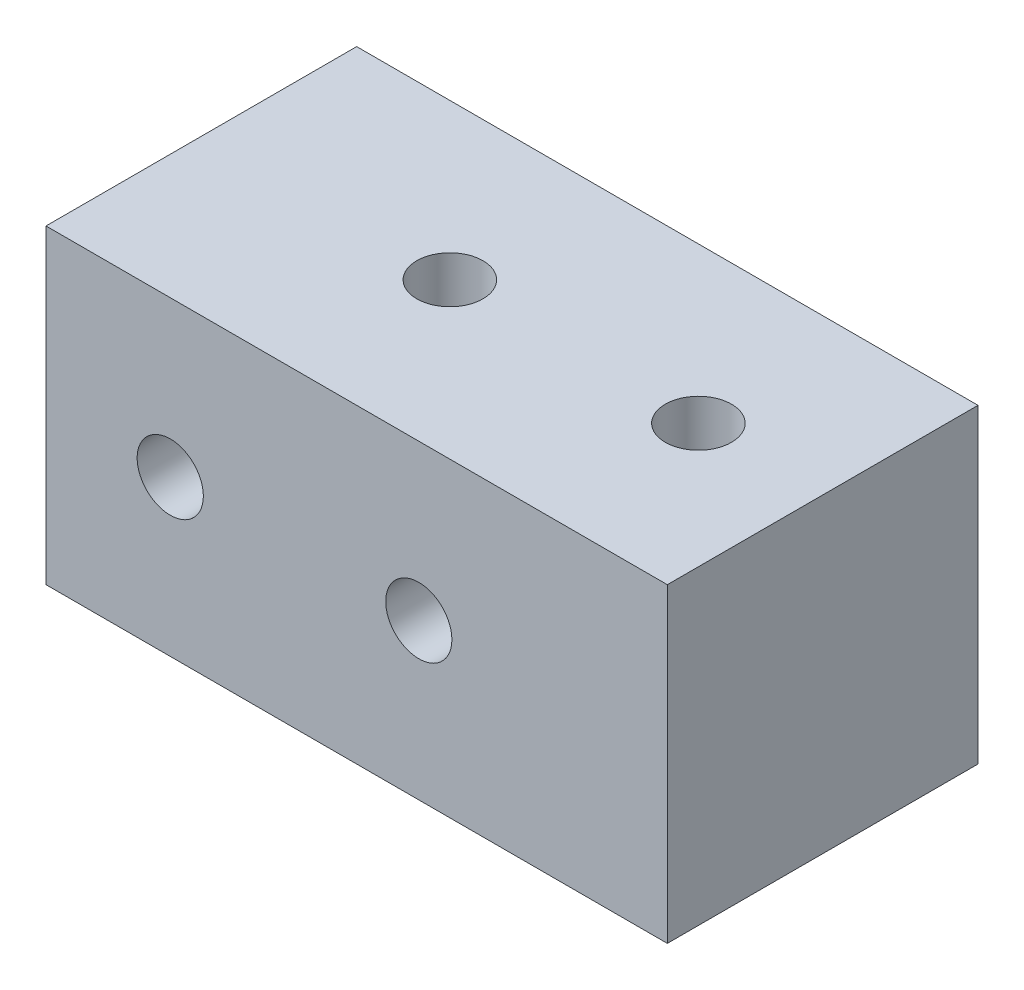
ISO-10303-21;
HEADER;
FILE_DESCRIPTION(('STEP AP214'),'2;1');
FILE_NAME('part.step','',(''),(''),'','','');
FILE_SCHEMA(('AUTOMOTIVE_DESIGN { 1 0 10303 214 1 1 1 1 }'));
ENDSEC;
DATA;
#1=APPLICATION_CONTEXT('core data for automotive mechanical design processes');
#2=APPLICATION_PROTOCOL_DEFINITION('international standard','automotive_design',2000,#1);
#3=PRODUCT_CONTEXT('',#1,'mechanical');
#4=PRODUCT('Part','Part','',(#3));
#5=PRODUCT_RELATED_PRODUCT_CATEGORY('part','',(#4));
#6=PRODUCT_DEFINITION_FORMATION('','',#4);
#7=PRODUCT_DEFINITION_CONTEXT('part definition',#1,'design');
#8=PRODUCT_DEFINITION('design','',#6,#7);
#9=PRODUCT_DEFINITION_SHAPE('','',#8);
#10=(LENGTH_UNIT() NAMED_UNIT(*) SI_UNIT(.MILLI.,.METRE.));
#11=(NAMED_UNIT(*) PLANE_ANGLE_UNIT() SI_UNIT($,.RADIAN.));
#12=(NAMED_UNIT(*) SI_UNIT($,.STERADIAN.) SOLID_ANGLE_UNIT());
#13=UNCERTAINTY_MEASURE_WITH_UNIT(LENGTH_MEASURE(1.E-05),#10,'distance_accuracy_value','');
#14=(GEOMETRIC_REPRESENTATION_CONTEXT(3) GLOBAL_UNCERTAINTY_ASSIGNED_CONTEXT((#13)) GLOBAL_UNIT_ASSIGNED_CONTEXT((#10,
#11,#12)) REPRESENTATION_CONTEXT('',''));
#15=CARTESIAN_POINT('',(0.,0.,0.));
#16=DIRECTION('',(0.,0.,1.));
#17=DIRECTION('',(1.,0.,0.));
#18=AXIS2_PLACEMENT_3D('',#15,#16,#17);
#19=CARTESIAN_POINT('',(-12.7,-6.35,12.7));
#20=DIRECTION('',(1.,0.,0.));
#21=DIRECTION('',(0.,0.,-1.));
#22=AXIS2_PLACEMENT_3D('',#19,#20,#21);
#23=PLANE('',#22);
#24=DIRECTION('',(0.,-1.,0.));
#25=VECTOR('',#24,1.);
#26=CARTESIAN_POINT('',(-12.7,-6.35,0.));
#27=LINE('',#26,#25);
#28=CARTESIAN_POINT('',(-12.7,6.35,0.));
#29=VERTEX_POINT('',#28);
#30=CARTESIAN_POINT('',(-12.7,-6.35,0.));
#31=VERTEX_POINT('',#30);
#32=EDGE_CURVE('E97',#29,#31,#27,.T.);
#33=ORIENTED_EDGE('',*,*,#32,.T.);
#34=DIRECTION('',(0.,0.,-1.));
#35=VECTOR('',#34,1.);
#36=CARTESIAN_POINT('',(-12.7,-6.35,12.7));
#37=LINE('',#36,#35);
#38=CARTESIAN_POINT('',(-12.7,-6.35,12.7));
#39=VERTEX_POINT('',#38);
#40=EDGE_CURVE('E11',#39,#31,#37,.T.);
#41=ORIENTED_EDGE('',*,*,#40,.F.);
#42=DIRECTION('',(0.,-1.,0.));
#43=VECTOR('',#42,1.);
#44=CARTESIAN_POINT('',(-12.7,-6.35,12.7));
#45=LINE('',#44,#43);
#46=CARTESIAN_POINT('',(-12.7,6.35,12.7));
#47=VERTEX_POINT('',#46);
#48=EDGE_CURVE('E85',#47,#39,#45,.T.);
#49=ORIENTED_EDGE('',*,*,#48,.F.);
#50=DIRECTION('',(0.,0.,-1.));
#51=VECTOR('',#50,1.);
#52=CARTESIAN_POINT('',(-12.7,6.35,12.7));
#53=LINE('',#52,#51);
#54=EDGE_CURVE('E93',#47,#29,#53,.T.);
#55=ORIENTED_EDGE('',*,*,#54,.T.);
#56=EDGE_LOOP('',(#33,#41,#49,#55));
#57=FACE_BOUND('',#56,.T.);
#58=ADVANCED_FACE('F34',(#57),#23,.F.);
#59=CARTESIAN_POINT('',(12.7,-6.35,12.7));
#60=DIRECTION('',(0.,1.,0.));
#61=DIRECTION('',(-1.,0.,0.));
#62=AXIS2_PLACEMENT_3D('',#59,#60,#61);
#63=PLANE('',#62);
#64=CARTESIAN_POINT('',(-2.54,-6.35,6.35));
#65=DIRECTION('',(0.,1.,0.));
#66=DIRECTION('',(0.,0.,1.));
#67=AXIS2_PLACEMENT_3D('',#64,#65,#66);
#68=CIRCLE('',#67,1.35255);
#69=CARTESIAN_POINT('',(-2.54,-6.35,7.70255));
#70=VERTEX_POINT('',#69);
#71=EDGE_CURVE('E116',#70,#70,#68,.T.);
#72=ORIENTED_EDGE('',*,*,#71,.T.);
#73=EDGE_LOOP('',(#72));
#74=FACE_BOUND('',#73,.T.);
#75=CARTESIAN_POINT('',(7.62,-6.35,6.35));
#76=DIRECTION('',(0.,1.,0.));
#77=DIRECTION('',(0.,0.,1.));
#78=AXIS2_PLACEMENT_3D('',#75,#76,#77);
#79=CIRCLE('',#78,1.35255);
#80=CARTESIAN_POINT('',(7.62,-6.35,7.70255));
#81=VERTEX_POINT('',#80);
#82=EDGE_CURVE('E100',#81,#81,#79,.T.);
#83=ORIENTED_EDGE('',*,*,#82,.T.);
#84=EDGE_LOOP('',(#83));
#85=FACE_BOUND('',#84,.T.);
#86=DIRECTION('',(1.,0.,0.));
#87=VECTOR('',#86,1.);
#88=CARTESIAN_POINT('',(12.7,-6.35,0.));
#89=LINE('',#88,#87);
#90=CARTESIAN_POINT('',(12.7,-6.35,0.));
#91=VERTEX_POINT('',#90);
#92=EDGE_CURVE('E89',#31,#91,#89,.T.);
#93=ORIENTED_EDGE('',*,*,#92,.T.);
#94=DIRECTION('',(0.,0.,-1.));
#95=VECTOR('',#94,1.);
#96=CARTESIAN_POINT('',(12.7,-6.35,12.7));
#97=LINE('',#96,#95);
#98=CARTESIAN_POINT('',(12.7,-6.35,12.7));
#99=VERTEX_POINT('',#98);
#100=EDGE_CURVE('E42',#99,#91,#97,.T.);
#101=ORIENTED_EDGE('',*,*,#100,.F.);
#102=DIRECTION('',(1.,0.,0.));
#103=VECTOR('',#102,1.);
#104=CARTESIAN_POINT('',(12.7,-6.35,12.7));
#105=LINE('',#104,#103);
#106=EDGE_CURVE('E80',#39,#99,#105,.T.);
#107=ORIENTED_EDGE('',*,*,#106,.F.);
#108=ORIENTED_EDGE('',*,*,#40,.T.);
#109=EDGE_LOOP('',(#93,#101,#107,#108));
#110=FACE_BOUND('',#109,.T.);
#111=ADVANCED_FACE('F88',(#74,#85,#110),#63,.F.);
#112=CARTESIAN_POINT('',(12.7,-6.35,12.7));
#113=DIRECTION('',(-1.,0.,0.));
#114=DIRECTION('',(0.,0.,1.));
#115=AXIS2_PLACEMENT_3D('',#112,#113,#114);
#116=PLANE('',#115);
#117=DIRECTION('',(0.,1.,0.));
#118=VECTOR('',#117,1.);
#119=CARTESIAN_POINT('',(12.7,-6.35,0.));
#120=LINE('',#119,#118);
#121=CARTESIAN_POINT('',(12.7,6.35,0.));
#122=VERTEX_POINT('',#121);
#123=EDGE_CURVE('E67',#91,#122,#120,.T.);
#124=ORIENTED_EDGE('',*,*,#123,.T.);
#125=DIRECTION('',(0.,0.,-1.));
#126=VECTOR('',#125,1.);
#127=CARTESIAN_POINT('',(12.7,6.35,12.7));
#128=LINE('',#127,#126);
#129=CARTESIAN_POINT('',(12.7,6.35,12.7));
#130=VERTEX_POINT('',#129);
#131=EDGE_CURVE('E90',#130,#122,#128,.T.);
#132=ORIENTED_EDGE('',*,*,#131,.F.);
#133=DIRECTION('',(0.,1.,0.));
#134=VECTOR('',#133,1.);
#135=CARTESIAN_POINT('',(12.7,-6.35,12.7));
#136=LINE('',#135,#134);
#137=EDGE_CURVE('E83',#99,#130,#136,.T.);
#138=ORIENTED_EDGE('',*,*,#137,.F.);
#139=ORIENTED_EDGE('',*,*,#100,.T.);
#140=EDGE_LOOP('',(#124,#132,#138,#139));
#141=FACE_BOUND('',#140,.T.);
#142=ADVANCED_FACE('F91',(#141),#116,.F.);
#143=CARTESIAN_POINT('',(12.7,6.35,12.7));
#144=DIRECTION('',(0.,-1.,0.));
#145=DIRECTION('',(1.,0.,0.));
#146=AXIS2_PLACEMENT_3D('',#143,#144,#145);
#147=PLANE('',#146);
#148=CARTESIAN_POINT('',(-2.54,6.35,6.35));
#149=DIRECTION('',(0.,1.,0.));
#150=DIRECTION('',(0.,0.,1.));
#151=AXIS2_PLACEMENT_3D('',#148,#149,#150);
#152=CIRCLE('',#151,1.35254999999999);
#153=CARTESIAN_POINT('',(-2.54,6.35,7.70254999999999));
#154=VERTEX_POINT('',#153);
#155=EDGE_CURVE('E119',#154,#154,#152,.T.);
#156=ORIENTED_EDGE('',*,*,#155,.F.);
#157=EDGE_LOOP('',(#156));
#158=FACE_BOUND('',#157,.T.);
#159=CARTESIAN_POINT('',(7.62,6.35,6.35));
#160=DIRECTION('',(0.,1.,0.));
#161=DIRECTION('',(0.,0.,1.));
#162=AXIS2_PLACEMENT_3D('',#159,#160,#161);
#163=CIRCLE('',#162,1.35254999999999);
#164=CARTESIAN_POINT('',(7.62,6.35,7.70254999999999));
#165=VERTEX_POINT('',#164);
#166=EDGE_CURVE('E113',#165,#165,#163,.T.);
#167=ORIENTED_EDGE('',*,*,#166,.F.);
#168=EDGE_LOOP('',(#167));
#169=FACE_BOUND('',#168,.T.);
#170=DIRECTION('',(-1.,0.,0.));
#171=VECTOR('',#170,1.);
#172=CARTESIAN_POINT('',(12.7,6.35,0.));
#173=LINE('',#172,#171);
#174=EDGE_CURVE('E73',#122,#29,#173,.T.);
#175=ORIENTED_EDGE('',*,*,#174,.T.);
#176=ORIENTED_EDGE('',*,*,#54,.F.);
#177=DIRECTION('',(-1.,0.,0.));
#178=VECTOR('',#177,1.);
#179=CARTESIAN_POINT('',(12.7,6.35,12.7));
#180=LINE('',#179,#178);
#181=EDGE_CURVE('E50',#130,#47,#180,.T.);
#182=ORIENTED_EDGE('',*,*,#181,.F.);
#183=ORIENTED_EDGE('',*,*,#131,.T.);
#184=EDGE_LOOP('',(#175,#176,#182,#183));
#185=FACE_BOUND('',#184,.T.);
#186=ADVANCED_FACE('F105',(#158,#169,#185),#147,.F.);
#187=CARTESIAN_POINT('',(0.,0.,12.7));
#188=DIRECTION('',(0.,0.,1.));
#189=DIRECTION('',(1.,0.,0.));
#190=AXIS2_PLACEMENT_3D('',#187,#188,#189);
#191=PLANE('',#190);
#192=CARTESIAN_POINT('',(-7.62,0.,12.7));
#193=DIRECTION('',(0.,0.,1.));
#194=DIRECTION('',(1.,0.,0.));
#195=AXIS2_PLACEMENT_3D('',#192,#193,#194);
#196=CIRCLE('',#195,1.35254999999999);
#197=CARTESIAN_POINT('',(-6.26745000000001,0.,12.7));
#198=VERTEX_POINT('',#197);
#199=EDGE_CURVE('E131',#198,#198,#196,.T.);
#200=ORIENTED_EDGE('',*,*,#199,.F.);
#201=EDGE_LOOP('',(#200));
#202=FACE_BOUND('',#201,.T.);
#203=CARTESIAN_POINT('',(2.54,0.,12.7));
#204=DIRECTION('',(0.,0.,1.));
#205=DIRECTION('',(1.,0.,0.));
#206=AXIS2_PLACEMENT_3D('',#203,#204,#205);
#207=CIRCLE('',#206,1.35254999999999);
#208=CARTESIAN_POINT('',(3.89254999999999,0.,12.7));
#209=VERTEX_POINT('',#208);
#210=EDGE_CURVE('E125',#209,#209,#207,.T.);
#211=ORIENTED_EDGE('',*,*,#210,.F.);
#212=EDGE_LOOP('',(#211));
#213=FACE_BOUND('',#212,.T.);
#214=ORIENTED_EDGE('',*,*,#48,.T.);
#215=ORIENTED_EDGE('',*,*,#106,.T.);
#216=ORIENTED_EDGE('',*,*,#137,.T.);
#217=ORIENTED_EDGE('',*,*,#181,.T.);
#218=EDGE_LOOP('',(#214,#215,#216,#217));
#219=FACE_BOUND('',#218,.T.);
#220=ADVANCED_FACE('F81',(#202,#213,#219),#191,.T.);
#221=CARTESIAN_POINT('',(0.,0.,0.));
#222=DIRECTION('',(0.,0.,1.));
#223=DIRECTION('',(1.,0.,0.));
#224=AXIS2_PLACEMENT_3D('',#221,#222,#223);
#225=PLANE('',#224);
#226=CARTESIAN_POINT('',(-7.62,0.,0.));
#227=DIRECTION('',(0.,0.,1.));
#228=DIRECTION('',(1.,0.,0.));
#229=AXIS2_PLACEMENT_3D('',#226,#227,#228);
#230=CIRCLE('',#229,1.35255);
#231=CARTESIAN_POINT('',(-6.26745,0.,0.));
#232=VERTEX_POINT('',#231);
#233=EDGE_CURVE('E128',#232,#232,#230,.T.);
#234=ORIENTED_EDGE('',*,*,#233,.T.);
#235=EDGE_LOOP('',(#234));
#236=FACE_BOUND('',#235,.T.);
#237=CARTESIAN_POINT('',(2.54,0.,0.));
#238=DIRECTION('',(0.,0.,1.));
#239=DIRECTION('',(1.,0.,0.));
#240=AXIS2_PLACEMENT_3D('',#237,#238,#239);
#241=CIRCLE('',#240,1.35255);
#242=CARTESIAN_POINT('',(3.89255,0.,0.));
#243=VERTEX_POINT('',#242);
#244=EDGE_CURVE('E122',#243,#243,#241,.T.);
#245=ORIENTED_EDGE('',*,*,#244,.T.);
#246=EDGE_LOOP('',(#245));
#247=FACE_BOUND('',#246,.T.);
#248=ORIENTED_EDGE('',*,*,#32,.F.);
#249=ORIENTED_EDGE('',*,*,#174,.F.);
#250=ORIENTED_EDGE('',*,*,#123,.F.);
#251=ORIENTED_EDGE('',*,*,#92,.F.);
#252=EDGE_LOOP('',(#248,#249,#250,#251));
#253=FACE_BOUND('',#252,.T.);
#254=ADVANCED_FACE('F108',(#236,#247,#253),#225,.F.);
#255=CARTESIAN_POINT('',(7.62,6.35,6.35));
#256=DIRECTION('',(0.,1.,0.));
#257=DIRECTION('',(0.,0.,1.));
#258=AXIS2_PLACEMENT_3D('',#255,#256,#257);
#259=CYLINDRICAL_SURFACE('',#258,1.35254999999999);
#260=ORIENTED_EDGE('',*,*,#82,.F.);
#261=EDGE_LOOP('',(#260));
#262=FACE_BOUND('',#261,.T.);
#263=ORIENTED_EDGE('',*,*,#166,.T.);
#264=EDGE_LOOP('',(#263));
#265=FACE_BOUND('',#264,.T.);
#266=ADVANCED_FACE('F153',(#262,#265),#259,.F.);
#267=CARTESIAN_POINT('',(-2.54,6.35,6.35));
#268=DIRECTION('',(0.,1.,0.));
#269=DIRECTION('',(0.,0.,1.));
#270=AXIS2_PLACEMENT_3D('',#267,#268,#269);
#271=CYLINDRICAL_SURFACE('',#270,1.35254999999999);
#272=ORIENTED_EDGE('',*,*,#71,.F.);
#273=EDGE_LOOP('',(#272));
#274=FACE_BOUND('',#273,.T.);
#275=ORIENTED_EDGE('',*,*,#155,.T.);
#276=EDGE_LOOP('',(#275));
#277=FACE_BOUND('',#276,.T.);
#278=ADVANCED_FACE('F144',(#274,#277),#271,.F.);
#279=CARTESIAN_POINT('',(2.54,0.,12.7));
#280=DIRECTION('',(0.,0.,1.));
#281=DIRECTION('',(1.,0.,0.));
#282=AXIS2_PLACEMENT_3D('',#279,#280,#281);
#283=CYLINDRICAL_SURFACE('',#282,1.35254999999999);
#284=ORIENTED_EDGE('',*,*,#244,.F.);
#285=EDGE_LOOP('',(#284));
#286=FACE_BOUND('',#285,.T.);
#287=ORIENTED_EDGE('',*,*,#210,.T.);
#288=EDGE_LOOP('',(#287));
#289=FACE_BOUND('',#288,.T.);
#290=ADVANCED_FACE('F142',(#286,#289),#283,.F.);
#291=CARTESIAN_POINT('',(-7.62,0.,12.7));
#292=DIRECTION('',(0.,0.,1.));
#293=DIRECTION('',(1.,0.,0.));
#294=AXIS2_PLACEMENT_3D('',#291,#292,#293);
#295=CYLINDRICAL_SURFACE('',#294,1.35254999999999);
#296=ORIENTED_EDGE('',*,*,#233,.F.);
#297=EDGE_LOOP('',(#296));
#298=FACE_BOUND('',#297,.T.);
#299=ORIENTED_EDGE('',*,*,#199,.T.);
#300=EDGE_LOOP('',(#299));
#301=FACE_BOUND('',#300,.T.);
#302=ADVANCED_FACE('F135',(#298,#301),#295,.F.);
#303=CLOSED_SHELL('',(#58,#111,#142,#186,#220,#254,#266,#278,#290,#302));
#304=MANIFOLD_SOLID_BREP('B2',#303);
#305=ADVANCED_BREP_SHAPE_REPRESENTATION('',(#18,#304),#14);
#306=SHAPE_DEFINITION_REPRESENTATION(#9,#305);
ENDSEC;
END-ISO-10303-21;
